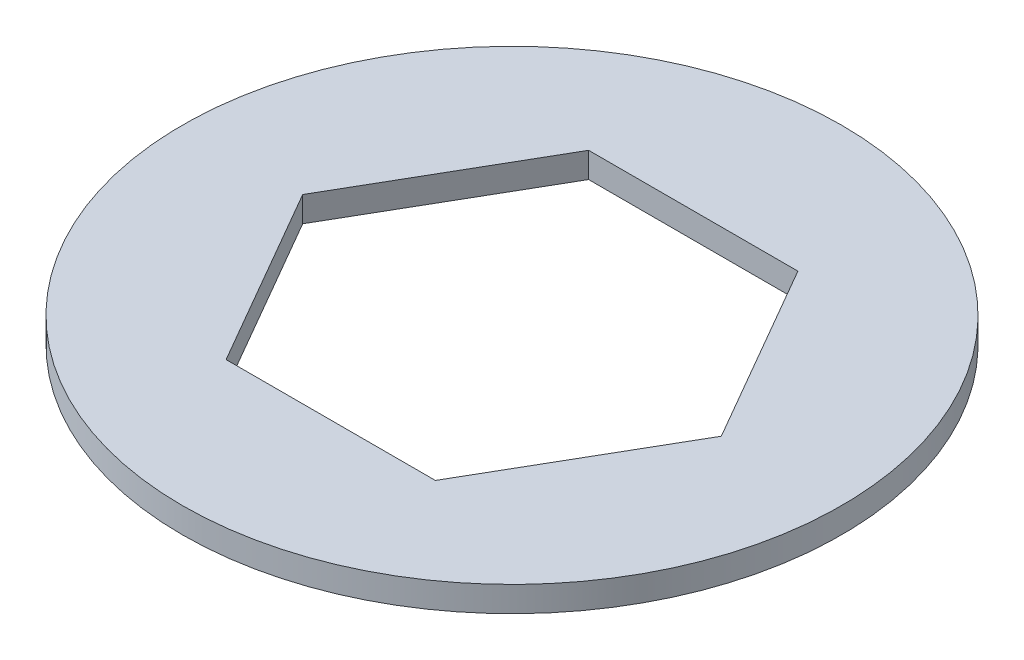
ISO-10303-21;
HEADER;
FILE_DESCRIPTION(('STEP AP214'),'2;1');
FILE_NAME('part.step','',(''),(''),'','','');
FILE_SCHEMA(('AUTOMOTIVE_DESIGN { 1 0 10303 214 1 1 1 1 }'));
ENDSEC;
DATA;
#1=APPLICATION_CONTEXT('core data for automotive mechanical design processes');
#2=APPLICATION_PROTOCOL_DEFINITION('international standard','automotive_design',2000,#1);
#3=PRODUCT_CONTEXT('',#1,'mechanical');
#4=PRODUCT('Part','Part','',(#3));
#5=PRODUCT_RELATED_PRODUCT_CATEGORY('part','',(#4));
#6=PRODUCT_DEFINITION_FORMATION('','',#4);
#7=PRODUCT_DEFINITION_CONTEXT('part definition',#1,'design');
#8=PRODUCT_DEFINITION('design','',#6,#7);
#9=PRODUCT_DEFINITION_SHAPE('','',#8);
#10=(LENGTH_UNIT() NAMED_UNIT(*) SI_UNIT(.MILLI.,.METRE.));
#11=(NAMED_UNIT(*) PLANE_ANGLE_UNIT() SI_UNIT($,.RADIAN.));
#12=(NAMED_UNIT(*) SI_UNIT($,.STERADIAN.) SOLID_ANGLE_UNIT());
#13=UNCERTAINTY_MEASURE_WITH_UNIT(LENGTH_MEASURE(1.E-05),#10,'distance_accuracy_value','');
#14=(GEOMETRIC_REPRESENTATION_CONTEXT(3) GLOBAL_UNCERTAINTY_ASSIGNED_CONTEXT((#13)) GLOBAL_UNIT_ASSIGNED_CONTEXT((#10,
#11,#12)) REPRESENTATION_CONTEXT('',''));
#15=CARTESIAN_POINT('',(0.,0.,0.));
#16=DIRECTION('',(0.,0.,1.));
#17=DIRECTION('',(1.,0.,0.));
#18=AXIS2_PLACEMENT_3D('',#15,#16,#17);
#19=CARTESIAN_POINT('',(0.,5.,0.));
#20=DIRECTION('',(0.,1.,0.));
#21=DIRECTION('',(0.,0.,1.));
#22=AXIS2_PLACEMENT_3D('',#19,#20,#21);
#23=PLANE('',#22);
#24=CARTESIAN_POINT('',(0.,5.,0.));
#25=DIRECTION('',(0.,1.,0.));
#26=DIRECTION('',(0.,0.,1.));
#27=AXIS2_PLACEMENT_3D('',#24,#25,#26);
#28=CIRCLE('',#27,65.);
#29=CARTESIAN_POINT('',(0.,5.,65.));
#30=VERTEX_POINT('',#29);
#31=EDGE_CURVE('E11',#30,#30,#28,.T.);
#32=ORIENTED_EDGE('',*,*,#31,.T.);
#33=EDGE_LOOP('',(#32));
#34=FACE_BOUND('',#33,.T.);
#35=DIRECTION('',(-0.5,0.,-0.866025403784439));
#36=VECTOR('',#35,1.);
#37=CARTESIAN_POINT('',(41.2805442470582,5.,0.));
#38=LINE('',#37,#36);
#39=CARTESIAN_POINT('',(41.2805442470582,5.,0.));
#40=VERTEX_POINT('',#39);
#41=CARTESIAN_POINT('',(20.6402721235291,5.,-35.75));
#42=VERTEX_POINT('',#41);
#43=EDGE_CURVE('E98',#40,#42,#38,.T.);
#44=ORIENTED_EDGE('',*,*,#43,.F.);
#45=DIRECTION('',(0.5,0.,-0.866025403784439));
#46=VECTOR('',#45,1.);
#47=CARTESIAN_POINT('',(20.6402721235291,5.,35.75));
#48=LINE('',#47,#46);
#49=CARTESIAN_POINT('',(20.6402721235291,5.,35.75));
#50=VERTEX_POINT('',#49);
#51=EDGE_CURVE('E90',#50,#40,#48,.T.);
#52=ORIENTED_EDGE('',*,*,#51,.F.);
#53=DIRECTION('',(1.,0.,0.));
#54=VECTOR('',#53,1.);
#55=CARTESIAN_POINT('',(-20.6402721235291,5.,35.75));
#56=LINE('',#55,#54);
#57=CARTESIAN_POINT('',(-20.6402721235291,5.,35.75));
#58=VERTEX_POINT('',#57);
#59=EDGE_CURVE('E118',#58,#50,#56,.T.);
#60=ORIENTED_EDGE('',*,*,#59,.F.);
#61=DIRECTION('',(0.5,0.,0.866025403784439));
#62=VECTOR('',#61,1.);
#63=CARTESIAN_POINT('',(-41.2805442470583,5.,0.));
#64=LINE('',#63,#62);
#65=CARTESIAN_POINT('',(-41.2805442470583,5.,0.));
#66=VERTEX_POINT('',#65);
#67=EDGE_CURVE('E116',#66,#58,#64,.T.);
#68=ORIENTED_EDGE('',*,*,#67,.F.);
#69=DIRECTION('',(-0.5,0.,0.866025403784439));
#70=VECTOR('',#69,1.);
#71=CARTESIAN_POINT('',(-20.6402721235291,5.,-35.75));
#72=LINE('',#71,#70);
#73=CARTESIAN_POINT('',(-20.6402721235291,5.,-35.75));
#74=VERTEX_POINT('',#73);
#75=EDGE_CURVE('E112',#74,#66,#72,.T.);
#76=ORIENTED_EDGE('',*,*,#75,.F.);
#77=DIRECTION('',(-1.,0.,0.));
#78=VECTOR('',#77,1.);
#79=CARTESIAN_POINT('',(20.6402721235291,5.,-35.75));
#80=LINE('',#79,#78);
#81=EDGE_CURVE('E110',#42,#74,#80,.T.);
#82=ORIENTED_EDGE('',*,*,#81,.F.);
#83=EDGE_LOOP('',(#44,#52,#60,#68,#76,#82));
#84=FACE_BOUND('',#83,.T.);
#85=ADVANCED_FACE('F37',(#34,#84),#23,.T.);
#86=CARTESIAN_POINT('',(0.,0.,0.));
#87=DIRECTION('',(0.,1.,0.));
#88=DIRECTION('',(0.,0.,1.));
#89=AXIS2_PLACEMENT_3D('',#86,#87,#88);
#90=PLANE('',#89);
#91=CARTESIAN_POINT('',(0.,0.,0.));
#92=DIRECTION('',(0.,1.,0.));
#93=DIRECTION('',(0.,0.,1.));
#94=AXIS2_PLACEMENT_3D('',#91,#92,#93);
#95=CIRCLE('',#94,65.);
#96=CARTESIAN_POINT('',(0.,0.,65.));
#97=VERTEX_POINT('',#96);
#98=EDGE_CURVE('E41',#97,#97,#95,.T.);
#99=ORIENTED_EDGE('',*,*,#98,.F.);
#100=EDGE_LOOP('',(#99));
#101=FACE_BOUND('',#100,.T.);
#102=DIRECTION('',(0.5,0.,-0.866025403784439));
#103=VECTOR('',#102,1.);
#104=CARTESIAN_POINT('',(20.6402721235291,0.,35.75));
#105=LINE('',#104,#103);
#106=CARTESIAN_POINT('',(20.6402721235291,0.,35.75));
#107=VERTEX_POINT('',#106);
#108=CARTESIAN_POINT('',(41.2805442470582,0.,0.));
#109=VERTEX_POINT('',#108);
#110=EDGE_CURVE('E60',#107,#109,#105,.T.);
#111=ORIENTED_EDGE('',*,*,#110,.T.);
#112=DIRECTION('',(-0.5,0.,-0.866025403784439));
#113=VECTOR('',#112,1.);
#114=CARTESIAN_POINT('',(41.2805442470582,0.,0.));
#115=LINE('',#114,#113);
#116=CARTESIAN_POINT('',(20.6402721235291,0.,-35.75));
#117=VERTEX_POINT('',#116);
#118=EDGE_CURVE('E105',#109,#117,#115,.T.);
#119=ORIENTED_EDGE('',*,*,#118,.T.);
#120=DIRECTION('',(-1.,0.,0.));
#121=VECTOR('',#120,1.);
#122=CARTESIAN_POINT('',(20.6402721235291,0.,-35.75));
#123=LINE('',#122,#121);
#124=CARTESIAN_POINT('',(-20.6402721235291,0.,-35.75));
#125=VERTEX_POINT('',#124);
#126=EDGE_CURVE('E122',#117,#125,#123,.T.);
#127=ORIENTED_EDGE('',*,*,#126,.T.);
#128=DIRECTION('',(-0.5,0.,0.866025403784439));
#129=VECTOR('',#128,1.);
#130=CARTESIAN_POINT('',(-20.6402721235291,0.,-35.75));
#131=LINE('',#130,#129);
#132=CARTESIAN_POINT('',(-41.2805442470583,0.,0.));
#133=VERTEX_POINT('',#132);
#134=EDGE_CURVE('E125',#125,#133,#131,.T.);
#135=ORIENTED_EDGE('',*,*,#134,.T.);
#136=DIRECTION('',(0.5,0.,0.866025403784439));
#137=VECTOR('',#136,1.);
#138=CARTESIAN_POINT('',(-41.2805442470583,0.,0.));
#139=LINE('',#138,#137);
#140=CARTESIAN_POINT('',(-20.6402721235291,0.,35.75));
#141=VERTEX_POINT('',#140);
#142=EDGE_CURVE('E128',#133,#141,#139,.T.);
#143=ORIENTED_EDGE('',*,*,#142,.T.);
#144=DIRECTION('',(1.,0.,0.));
#145=VECTOR('',#144,1.);
#146=CARTESIAN_POINT('',(-20.6402721235291,0.,35.75));
#147=LINE('',#146,#145);
#148=EDGE_CURVE('E99',#141,#107,#147,.T.);
#149=ORIENTED_EDGE('',*,*,#148,.T.);
#150=EDGE_LOOP('',(#111,#119,#127,#135,#143,#149));
#151=FACE_BOUND('',#150,.T.);
#152=ADVANCED_FACE('F145',(#101,#151),#90,.F.);
#153=CARTESIAN_POINT('',(0.,5.,0.));
#154=DIRECTION('',(0.,-1.,0.));
#155=DIRECTION('',(0.,0.,-1.));
#156=AXIS2_PLACEMENT_3D('',#153,#154,#155);
#157=CYLINDRICAL_SURFACE('',#156,65.);
#158=ORIENTED_EDGE('',*,*,#31,.F.);
#159=EDGE_LOOP('',(#158));
#160=FACE_BOUND('',#159,.T.);
#161=ORIENTED_EDGE('',*,*,#98,.T.);
#162=EDGE_LOOP('',(#161));
#163=FACE_BOUND('',#162,.T.);
#164=ADVANCED_FACE('F39',(#160,#163),#157,.T.);
#165=CARTESIAN_POINT('',(20.6402721235291,5.,35.75));
#166=DIRECTION('',(-0.866025403784439,0.,-0.5));
#167=DIRECTION('',(-0.5,0.,0.866025403784439));
#168=AXIS2_PLACEMENT_3D('',#165,#166,#167);
#169=PLANE('',#168);
#170=ORIENTED_EDGE('',*,*,#110,.F.);
#171=DIRECTION('',(0.,-1.,0.));
#172=VECTOR('',#171,1.);
#173=CARTESIAN_POINT('',(20.6402721235291,5.,35.75));
#174=LINE('',#173,#172);
#175=EDGE_CURVE('E94',#50,#107,#174,.T.);
#176=ORIENTED_EDGE('',*,*,#175,.F.);
#177=ORIENTED_EDGE('',*,*,#51,.T.);
#178=DIRECTION('',(0.,-1.,0.));
#179=VECTOR('',#178,1.);
#180=CARTESIAN_POINT('',(41.2805442470582,5.,0.));
#181=LINE('',#180,#179);
#182=EDGE_CURVE('E93',#40,#109,#181,.T.);
#183=ORIENTED_EDGE('',*,*,#182,.T.);
#184=EDGE_LOOP('',(#170,#176,#177,#183));
#185=FACE_BOUND('',#184,.T.);
#186=ADVANCED_FACE('F92',(#185),#169,.T.);
#187=CARTESIAN_POINT('',(41.2805442470582,5.,0.));
#188=DIRECTION('',(-0.866025403784439,0.,0.5));
#189=DIRECTION('',(0.5,0.,0.866025403784439));
#190=AXIS2_PLACEMENT_3D('',#187,#188,#189);
#191=PLANE('',#190);
#192=ORIENTED_EDGE('',*,*,#118,.F.);
#193=ORIENTED_EDGE('',*,*,#182,.F.);
#194=ORIENTED_EDGE('',*,*,#43,.T.);
#195=DIRECTION('',(0.,-1.,0.));
#196=VECTOR('',#195,1.);
#197=CARTESIAN_POINT('',(20.6402721235291,5.,-35.75));
#198=LINE('',#197,#196);
#199=EDGE_CURVE('E106',#42,#117,#198,.T.);
#200=ORIENTED_EDGE('',*,*,#199,.T.);
#201=EDGE_LOOP('',(#192,#193,#194,#200));
#202=FACE_BOUND('',#201,.T.);
#203=ADVANCED_FACE('F102',(#202),#191,.T.);
#204=CARTESIAN_POINT('',(20.6402721235291,5.,-35.75));
#205=DIRECTION('',(0.,0.,1.));
#206=DIRECTION('',(1.,0.,0.));
#207=AXIS2_PLACEMENT_3D('',#204,#205,#206);
#208=PLANE('',#207);
#209=ORIENTED_EDGE('',*,*,#126,.F.);
#210=ORIENTED_EDGE('',*,*,#199,.F.);
#211=ORIENTED_EDGE('',*,*,#81,.T.);
#212=DIRECTION('',(0.,-1.,0.));
#213=VECTOR('',#212,1.);
#214=CARTESIAN_POINT('',(-20.6402721235291,5.,-35.75));
#215=LINE('',#214,#213);
#216=EDGE_CURVE('E137',#74,#125,#215,.T.);
#217=ORIENTED_EDGE('',*,*,#216,.T.);
#218=EDGE_LOOP('',(#209,#210,#211,#217));
#219=FACE_BOUND('',#218,.T.);
#220=ADVANCED_FACE('F141',(#219),#208,.T.);
#221=CARTESIAN_POINT('',(-20.6402721235291,5.,-35.75));
#222=DIRECTION('',(0.866025403784439,0.,0.5));
#223=DIRECTION('',(0.5,0.,-0.866025403784439));
#224=AXIS2_PLACEMENT_3D('',#221,#222,#223);
#225=PLANE('',#224);
#226=ORIENTED_EDGE('',*,*,#134,.F.);
#227=ORIENTED_EDGE('',*,*,#216,.F.);
#228=ORIENTED_EDGE('',*,*,#75,.T.);
#229=DIRECTION('',(0.,-1.,0.));
#230=VECTOR('',#229,1.);
#231=CARTESIAN_POINT('',(-41.2805442470583,5.,0.));
#232=LINE('',#231,#230);
#233=EDGE_CURVE('E135',#66,#133,#232,.T.);
#234=ORIENTED_EDGE('',*,*,#233,.T.);
#235=EDGE_LOOP('',(#226,#227,#228,#234));
#236=FACE_BOUND('',#235,.T.);
#237=ADVANCED_FACE('F153',(#236),#225,.T.);
#238=CARTESIAN_POINT('',(-41.2805442470583,5.,0.));
#239=DIRECTION('',(0.866025403784439,0.,-0.5));
#240=DIRECTION('',(-0.5,0.,-0.866025403784439));
#241=AXIS2_PLACEMENT_3D('',#238,#239,#240);
#242=PLANE('',#241);
#243=ORIENTED_EDGE('',*,*,#142,.F.);
#244=ORIENTED_EDGE('',*,*,#233,.F.);
#245=ORIENTED_EDGE('',*,*,#67,.T.);
#246=DIRECTION('',(0.,-1.,0.));
#247=VECTOR('',#246,1.);
#248=CARTESIAN_POINT('',(-20.6402721235291,5.,35.75));
#249=LINE('',#248,#247);
#250=EDGE_CURVE('E52',#58,#141,#249,.T.);
#251=ORIENTED_EDGE('',*,*,#250,.T.);
#252=EDGE_LOOP('',(#243,#244,#245,#251));
#253=FACE_BOUND('',#252,.T.);
#254=ADVANCED_FACE('F151',(#253),#242,.T.);
#255=CARTESIAN_POINT('',(-20.6402721235291,5.,35.75));
#256=DIRECTION('',(0.,0.,-1.));
#257=DIRECTION('',(-1.,0.,0.));
#258=AXIS2_PLACEMENT_3D('',#255,#256,#257);
#259=PLANE('',#258);
#260=ORIENTED_EDGE('',*,*,#148,.F.);
#261=ORIENTED_EDGE('',*,*,#250,.F.);
#262=ORIENTED_EDGE('',*,*,#59,.T.);
#263=ORIENTED_EDGE('',*,*,#175,.T.);
#264=EDGE_LOOP('',(#260,#261,#262,#263));
#265=FACE_BOUND('',#264,.T.);
#266=ADVANCED_FACE('F147',(#265),#259,.T.);
#267=CLOSED_SHELL('',(#85,#152,#164,#186,#203,#220,#237,#254,#266));
#268=MANIFOLD_SOLID_BREP('B2',#267);
#269=ADVANCED_BREP_SHAPE_REPRESENTATION('',(#18,#268),#14);
#270=SHAPE_DEFINITION_REPRESENTATION(#9,#269);
ENDSEC;
END-ISO-10303-21;
